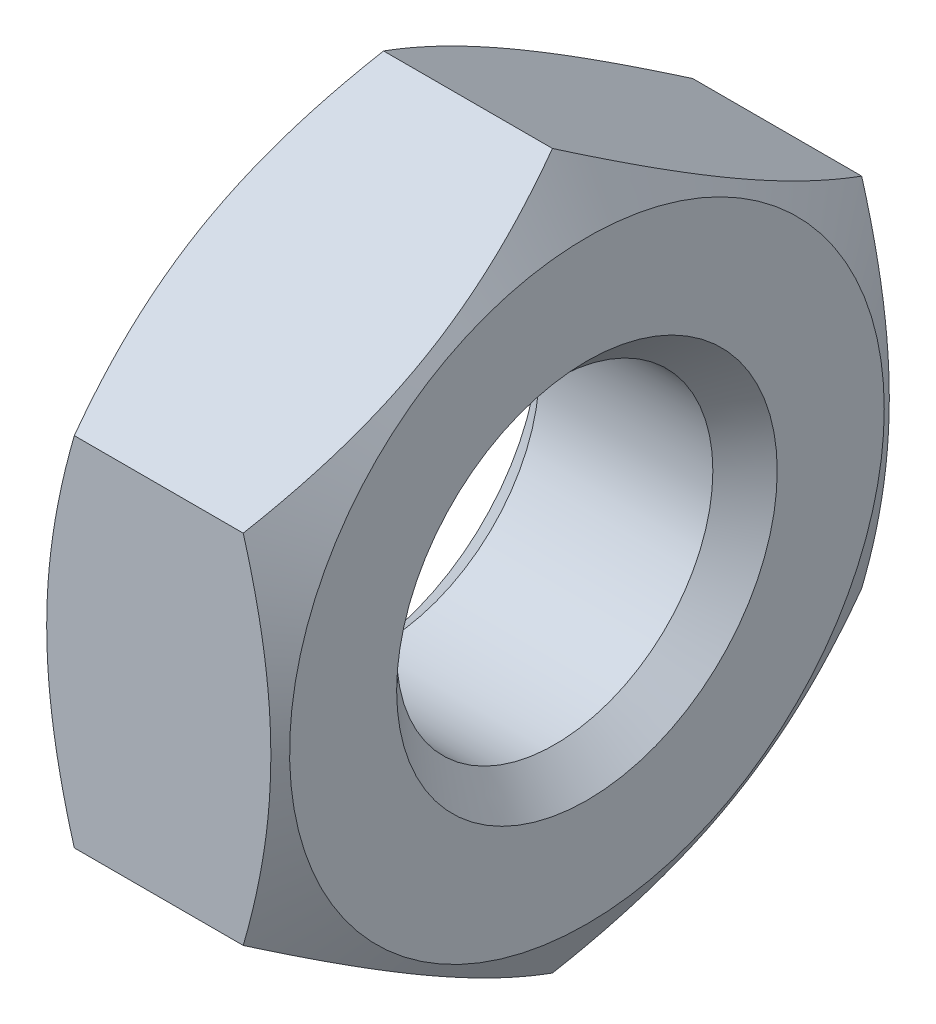
ISO-10303-21;
HEADER;
FILE_DESCRIPTION(('STEP AP214'),'2;1');
FILE_NAME('part.step','',(''),(''),'','','');
FILE_SCHEMA(('AUTOMOTIVE_DESIGN { 1 0 10303 214 1 1 1 1 }'));
ENDSEC;
DATA;
#1=APPLICATION_CONTEXT('core data for automotive mechanical design processes');
#2=APPLICATION_PROTOCOL_DEFINITION('international standard','automotive_design',2000,#1);
#3=PRODUCT_CONTEXT('',#1,'mechanical');
#4=PRODUCT('Part','Part','',(#3));
#5=PRODUCT_RELATED_PRODUCT_CATEGORY('part','',(#4));
#6=PRODUCT_DEFINITION_FORMATION('','',#4);
#7=PRODUCT_DEFINITION_CONTEXT('part definition',#1,'design');
#8=PRODUCT_DEFINITION('design','',#6,#7);
#9=PRODUCT_DEFINITION_SHAPE('','',#8);
#10=(LENGTH_UNIT() NAMED_UNIT(*) SI_UNIT(.MILLI.,.METRE.));
#11=(NAMED_UNIT(*) PLANE_ANGLE_UNIT() SI_UNIT($,.RADIAN.));
#12=(NAMED_UNIT(*) SI_UNIT($,.STERADIAN.) SOLID_ANGLE_UNIT());
#13=UNCERTAINTY_MEASURE_WITH_UNIT(LENGTH_MEASURE(1.E-05),#10,'distance_accuracy_value','');
#14=(GEOMETRIC_REPRESENTATION_CONTEXT(3) GLOBAL_UNCERTAINTY_ASSIGNED_CONTEXT((#13)) GLOBAL_UNIT_ASSIGNED_CONTEXT((#10,
#11,#12)) REPRESENTATION_CONTEXT('',''));
#15=CARTESIAN_POINT('',(0.,0.,0.));
#16=DIRECTION('',(0.,0.,1.));
#17=DIRECTION('',(1.,0.,0.));
#18=AXIS2_PLACEMENT_3D('',#15,#16,#17);
#19=CARTESIAN_POINT('',(2.5,0.,0.));
#20=DIRECTION('',(1.,0.,0.));
#21=DIRECTION('',(0.,0.,-1.));
#22=AXIS2_PLACEMENT_3D('',#19,#20,#21);
#23=PLANE('',#22);
#24=CARTESIAN_POINT('',(2.5,0.,0.));
#25=DIRECTION('',(1.,0.,0.));
#26=DIRECTION('',(0.,0.,-1.));
#27=AXIS2_PLACEMENT_3D('',#24,#25,#26);
#28=CIRCLE('',#27,3.99999999999999);
#29=CARTESIAN_POINT('',(2.5,0.,-3.99999999999999));
#30=VERTEX_POINT('',#29);
#31=EDGE_CURVE('E12',#30,#30,#28,.F.);
#32=ORIENTED_EDGE('',*,*,#31,.T.);
#33=EDGE_LOOP('',(#32));
#34=FACE_BOUND('',#33,.T.);
#35=CARTESIAN_POINT('',(2.5,0.,0.));
#36=DIRECTION('',(1.,0.,0.));
#37=DIRECTION('',(0.,0.,-1.));
#38=AXIS2_PLACEMENT_3D('',#35,#36,#37);
#39=CIRCLE('',#38,6.25);
#40=CARTESIAN_POINT('',(2.5,0.,-6.25));
#41=VERTEX_POINT('',#40);
#42=EDGE_CURVE('E311',#41,#41,#39,.T.);
#43=ORIENTED_EDGE('',*,*,#42,.T.);
#44=EDGE_LOOP('',(#43));
#45=FACE_BOUND('',#44,.T.);
#46=ADVANCED_FACE('F52',(#34,#45),#23,.T.);
#47=CARTESIAN_POINT('',(2.5,-3.7527767497326,-6.5));
#48=DIRECTION('',(0.,0.,1.));
#49=DIRECTION('',(1.,0.,0.));
#50=AXIS2_PLACEMENT_3D('',#47,#48,#49);
#51=PLANE('',#50);
#52=DIRECTION('',(-1.,0.,0.));
#53=VECTOR('',#52,1.);
#54=CARTESIAN_POINT('',(2.5,-3.7527767497326,-6.5));
#55=LINE('',#54,#53);
#56=CARTESIAN_POINT('',(1.7751058491021,-3.75277674973308,-6.5));
#57=VERTEX_POINT('',#56);
#58=CARTESIAN_POINT('',(-1.7751058491021,-3.75277674973308,-6.5));
#59=VERTEX_POINT('',#58);
#60=EDGE_CURVE('E498',#57,#59,#55,.T.);
#61=ORIENTED_EDGE('',*,*,#60,.T.);
#62=CARTESIAN_POINT('',(-1.7751058491021,-3.75277674973308,-6.5));
#63=CARTESIAN_POINT('',(-1.84832684610049,-3.499131775769,-6.5));
#64=CARTESIAN_POINT('',(-1.91779853135632,-3.23864657335637,-6.5));
#65=CARTESIAN_POINT('',(-2.13073900859658,-2.3541337637969,-6.5));
#66=CARTESIAN_POINT('',(-2.24546268397608,-1.70890627516408,-6.5));
#67=CARTESIAN_POINT('',(-2.3384851778033,-0.713276650029492,-6.5));
#68=CARTESIAN_POINT('',(-2.35508917844649,-0.356511537320582,-6.5));
#69=CARTESIAN_POINT('',(-2.35516043665236,1.00336414524116E-07,-6.5));
#70=B_SPLINE_CURVE_WITH_KNOTS('',3,(#62,#63,#64,#65,#66,#67,#68,#69),.UNSPECIFIED.,.F.,.F.,(4,2,
2,4),(0.,0.10439310637018,0.359751575430984,0.499804918726466),.UNSPECIFIED.);
#71=CARTESIAN_POINT('',(-2.35566243270259,0.,-6.5));
#72=VERTEX_POINT('',#71);
#73=EDGE_CURVE('E501',#59,#72,#70,.T.);
#74=ORIENTED_EDGE('',*,*,#73,.T.);
#75=CARTESIAN_POINT('',(-2.35516043665236,1.00336414524116E-07,-6.5));
#76=CARTESIAN_POINT('',(-2.3552191031304,0.293514116135507,-6.5));
#77=CARTESIAN_POINT('',(-2.34407165224937,0.586856323102029,-6.5));
#78=CARTESIAN_POINT('',(-2.24664519389048,1.84805337930432,-6.5));
#79=CARTESIAN_POINT('',(-2.04506645528435,2.81760577783207,-6.5));
#80=CARTESIAN_POINT('',(-1.77510584910179,3.7527767497326,-6.5));
#81=B_SPLINE_CURVE_WITH_KNOTS('',3,(#75,#76,#77,#78,#79,#80),.UNSPECIFIED.,.F.,.F.,(4,2,4),
(0.499804918726466,0.615110044491788,1.),.UNSPECIFIED.);
#82=CARTESIAN_POINT('',(-1.77510584910179,3.7527767497326,-6.5));
#83=VERTEX_POINT('',#82);
#84=EDGE_CURVE('E504',#72,#83,#81,.T.);
#85=ORIENTED_EDGE('',*,*,#84,.T.);
#86=DIRECTION('',(-1.,0.,0.));
#87=VECTOR('',#86,1.);
#88=CARTESIAN_POINT('',(2.5,3.7527767497326,-6.5));
#89=LINE('',#88,#87);
#90=CARTESIAN_POINT('',(1.77510584910179,3.7527767497326,-6.5));
#91=VERTEX_POINT('',#90);
#92=EDGE_CURVE('E153',#91,#83,#89,.T.);
#93=ORIENTED_EDGE('',*,*,#92,.F.);
#94=CARTESIAN_POINT('',(1.77510584910179,3.7527767497326,-6.5));
#95=CARTESIAN_POINT('',(2.04506645528435,2.81760577783207,-6.5));
#96=CARTESIAN_POINT('',(2.24664519389048,1.84805337930432,-6.5));
#97=CARTESIAN_POINT('',(2.34407165224937,0.586856323102031,-6.5));
#98=CARTESIAN_POINT('',(2.3552191031304,0.293514116135509,-6.5));
#99=CARTESIAN_POINT('',(2.35516043665236,1.0033641669252E-07,-6.5));
#100=B_SPLINE_CURVE_WITH_KNOTS('',3,(#94,#95,#96,#97,#98,#99),.UNSPECIFIED.,.F.,.F.,(4,2,4),(0.,
0.384889955508212,0.500195081273534),.UNSPECIFIED.);
#101=CARTESIAN_POINT('',(2.35566243270259,0.,-6.5));
#102=VERTEX_POINT('',#101);
#103=EDGE_CURVE('E508',#91,#102,#100,.T.);
#104=ORIENTED_EDGE('',*,*,#103,.T.);
#105=CARTESIAN_POINT('',(2.35516043665236,1.0033641669252E-07,-6.5));
#106=CARTESIAN_POINT('',(2.35508917844649,-0.356511537320579,-6.5));
#107=CARTESIAN_POINT('',(2.3384851778033,-0.713276650029488,-6.5));
#108=CARTESIAN_POINT('',(2.24546268397608,-1.70890627516408,-6.5));
#109=CARTESIAN_POINT('',(2.13073900859659,-2.35413376379689,-6.5));
#110=CARTESIAN_POINT('',(1.91779853135632,-3.23864657335637,-6.5));
#111=CARTESIAN_POINT('',(1.84832684610049,-3.49913177576899,-6.5));
#112=CARTESIAN_POINT('',(1.7751058491021,-3.75277674973308,-6.5));
#113=B_SPLINE_CURVE_WITH_KNOTS('',3,(#105,#106,#107,#108,#109,#110,#111,#112),.UNSPECIFIED.,.F.,
.F.,(4,2,2,4),(0.500195081273534,0.640248424569016,0.895606893629819,1.),.UNSPECIFIED.);
#114=EDGE_CURVE('E495',#102,#57,#113,.T.);
#115=ORIENTED_EDGE('',*,*,#114,.T.);
#116=EDGE_LOOP('',(#61,#74,#85,#93,#104,#115));
#117=FACE_BOUND('',#116,.T.);
#118=ADVANCED_FACE('F193',(#117),#51,.F.);
#119=CARTESIAN_POINT('',(0.,0.,0.));
#120=DIRECTION('',(-1.,0.,0.));
#121=DIRECTION('',(0.,-1.,0.));
#122=AXIS2_PLACEMENT_3D('',#119,#120,#121);
#123=CONICAL_SURFACE('',#122,10.580127018922,1.04719755119658);
#124=CARTESIAN_POINT('',(2.35516043665236,1.00336414957797E-07,6.5));
#125=CARTESIAN_POINT('',(2.3552191031304,0.293514116135507,6.5));
#126=CARTESIAN_POINT('',(2.34407165224937,0.586856323102029,6.5));
#127=CARTESIAN_POINT('',(2.24664519389048,1.84805337930432,6.5));
#128=CARTESIAN_POINT('',(2.04506645528435,2.81760577783207,6.5));
#129=CARTESIAN_POINT('',(1.77510584910179,3.7527767497326,6.5));
#130=B_SPLINE_CURVE_WITH_KNOTS('',3,(#124,#125,#126,#127,#128,#129),.UNSPECIFIED.,.F.,.F.,(4,2,
4),(0.499804918726445,0.615110044491772,1.),.UNSPECIFIED.);
#131=CARTESIAN_POINT('',(2.35566243270259,0.,6.5));
#132=VERTEX_POINT('',#131);
#133=CARTESIAN_POINT('',(1.77510584910179,3.7527767497326,6.5));
#134=VERTEX_POINT('',#133);
#135=EDGE_CURVE('E69',#132,#134,#130,.T.);
#136=ORIENTED_EDGE('',*,*,#135,.F.);
#137=CARTESIAN_POINT('',(1.77510584910179,-3.7527767497326,6.5));
#138=CARTESIAN_POINT('',(1.84832684610014,-3.49913177576862,6.5));
#139=CARTESIAN_POINT('',(1.91779853135635,-3.23864657335627,6.5));
#140=CARTESIAN_POINT('',(2.13073900859659,-2.35413376379689,6.5));
#141=CARTESIAN_POINT('',(2.24546268397608,-1.70890627516408,6.5));
#142=CARTESIAN_POINT('',(2.3384851778033,-0.713276650029488,6.5));
#143=CARTESIAN_POINT('',(2.35508917844649,-0.35651153732058,6.5));
#144=CARTESIAN_POINT('',(2.35516043665236,1.00336414957797E-07,6.5));
#145=B_SPLINE_CURVE_WITH_KNOTS('',3,(#137,#138,#139,#140,#141,#142,#143,#144),.UNSPECIFIED.,.F.,
.F.,(4,2,2,4),(0.,0.104393106370142,0.359751575430957,0.499804918726445),.UNSPECIFIED.);
#146=CARTESIAN_POINT('',(1.77510584910179,-3.7527767497326,6.5));
#147=VERTEX_POINT('',#146);
#148=EDGE_CURVE('E74',#147,#132,#145,.T.);
#149=ORIENTED_EDGE('',*,*,#148,.F.);
#150=CARTESIAN_POINT('',(1.77503918089672,-7.50566896951893,-0.000200000000001414));
#151=CARTESIAN_POINT('',(1.96277117666729,-7.18052262104625,0.562969995450193));
#152=CARTESIAN_POINT('',(2.11841916481587,-6.84652652333584,1.14146820621437));
#153=CARTESIAN_POINT('',(2.32097290190676,-6.17729794516983,2.30060610547501));
#154=CARTESIAN_POINT('',(2.36852506887334,-5.83408564151025,2.89506725319617));
#155=CARTESIAN_POINT('',(2.33855983788199,-5.20136437402766,3.99097263550541));
#156=CARTESIAN_POINT('',(2.27696933775202,-4.90503247904517,4.50423453351826));
#157=CARTESIAN_POINT('',(2.07729007331418,-4.32460789500159,5.50955940304378));
#158=CARTESIAN_POINT('',(1.93839113803318,-4.03558211137176,6.01016674498807));
#159=CARTESIAN_POINT('',(1.77503918089669,-3.75266127967876,6.5002));
#160=B_SPLINE_CURVE_WITH_KNOTS('',3,(#150,#151,#152,#153,#154,#155,#156,#157,#158,#159),
.UNSPECIFIED.,.F.,.F.,(4,2,2,2,4),(0.,0.267360547550097,0.534721095100195,0.767360547550097,1.),.UNSPECIFIED.);
#161=CARTESIAN_POINT('',(1.77510584910182,-7.5055534994651,0.));
#162=VERTEX_POINT('',#161);
#163=EDGE_CURVE('E347',#162,#147,#160,.T.);
#164=ORIENTED_EDGE('',*,*,#163,.F.);
#165=CARTESIAN_POINT('',(1.77503918089669,-3.75266127967876,-6.5002));
#166=CARTESIAN_POINT('',(1.96277117666726,-4.07780762815145,-5.93703000454981));
#167=CARTESIAN_POINT('',(2.11841916481584,-4.41180372586186,-5.35853179378562));
#168=CARTESIAN_POINT('',(2.32097290190675,-5.08103230402788,-4.19939389452497));
#169=CARTESIAN_POINT('',(2.36852506887333,-5.42424460768746,-3.60493274680382));
#170=CARTESIAN_POINT('',(2.338559837882,-6.05696587517005,-2.50902736449458));
#171=CARTESIAN_POINT('',(2.27696933775203,-6.35329777015254,-1.99576546648173));
#172=CARTESIAN_POINT('',(2.0772900733142,-6.93372235419611,-0.990440596956211));
#173=CARTESIAN_POINT('',(1.93839113803321,-7.22274813782594,-0.489833255011931));
#174=CARTESIAN_POINT('',(1.77503918089672,-7.50566896951894,0.000200000000000604));
#175=B_SPLINE_CURVE_WITH_KNOTS('',3,(#165,#166,#167,#168,#169,#170,#171,#172,#173,#174),
.UNSPECIFIED.,.F.,.F.,(4,2,2,2,4),(0.,0.267360547550099,0.534721095100198,0.767360547550099,1.),.UNSPECIFIED.);
#176=EDGE_CURVE('E492',#57,#162,#175,.T.);
#177=ORIENTED_EDGE('',*,*,#176,.F.);
#178=ORIENTED_EDGE('',*,*,#114,.F.);
#179=ORIENTED_EDGE('',*,*,#103,.F.);
#180=CARTESIAN_POINT('',(1.77503918089672,7.50566896951893,0.000200000000001414));
#181=CARTESIAN_POINT('',(1.96277117666729,7.18052262104625,-0.562969995450193));
#182=CARTESIAN_POINT('',(2.11841916481587,6.84652652333584,-1.14146820621437));
#183=CARTESIAN_POINT('',(2.32097290190676,6.17729794516983,-2.30060610547501));
#184=CARTESIAN_POINT('',(2.36852506887334,5.83408564151025,-2.89506725319617));
#185=CARTESIAN_POINT('',(2.33855983788199,5.20136437402766,-3.99097263550541));
#186=CARTESIAN_POINT('',(2.27696933775202,4.90503247904517,-4.50423453351826));
#187=CARTESIAN_POINT('',(2.07729007331418,4.32460789500159,-5.50955940304378));
#188=CARTESIAN_POINT('',(1.93839113803318,4.03558211137176,-6.01016674498806));
#189=CARTESIAN_POINT('',(1.77503918089669,3.75266127967876,-6.5002));
#190=B_SPLINE_CURVE_WITH_KNOTS('',3,(#180,#181,#182,#183,#184,#185,#186,#187,#188,#189),
.UNSPECIFIED.,.F.,.F.,(4,2,2,2,4),(0.,0.267360547550097,0.534721095100195,0.767360547550097,1.),.UNSPECIFIED.);
#191=CARTESIAN_POINT('',(1.77510584910182,7.5055534994651,0.));
#192=VERTEX_POINT('',#191);
#193=EDGE_CURVE('E511',#192,#91,#190,.T.);
#194=ORIENTED_EDGE('',*,*,#193,.F.);
#195=CARTESIAN_POINT('',(1.77503918089669,3.75266127967876,6.5002));
#196=CARTESIAN_POINT('',(1.96277117666726,4.07780762815145,5.93703000454981));
#197=CARTESIAN_POINT('',(2.11841916481584,4.41180372586186,5.35853179378562));
#198=CARTESIAN_POINT('',(2.32097290190675,5.08103230402788,4.19939389452497));
#199=CARTESIAN_POINT('',(2.36852506887333,5.42424460768746,3.60493274680382));
#200=CARTESIAN_POINT('',(2.338559837882,6.05696587517005,2.50902736449458));
#201=CARTESIAN_POINT('',(2.27696933775203,6.35329777015254,1.99576546648173));
#202=CARTESIAN_POINT('',(2.0772900733142,6.93372235419611,0.990440596956211));
#203=CARTESIAN_POINT('',(1.93839113803321,7.22274813782594,0.489833255011931));
#204=CARTESIAN_POINT('',(1.77503918089672,7.50566896951894,-0.000200000000000412));
#205=B_SPLINE_CURVE_WITH_KNOTS('',3,(#195,#196,#197,#198,#199,#200,#201,#202,#203,#204),
.UNSPECIFIED.,.F.,.F.,(4,2,2,2,4),(0.,0.267360547550099,0.534721095100198,0.767360547550099,1.),.UNSPECIFIED.);
#206=EDGE_CURVE('E144',#134,#192,#205,.T.);
#207=ORIENTED_EDGE('',*,*,#206,.F.);
#208=EDGE_LOOP('',(#136,#149,#164,#177,#178,#179,#194,#207));
#209=FACE_BOUND('',#208,.T.);
#210=ORIENTED_EDGE('',*,*,#42,.F.);
#211=EDGE_LOOP('',(#210));
#212=FACE_BOUND('',#211,.T.);
#213=ADVANCED_FACE('F203',(#209,#212),#123,.T.);
#214=CARTESIAN_POINT('',(2.5,3.7527767497326,6.5));
#215=DIRECTION('',(0.,0.,-1.));
#216=DIRECTION('',(-1.,0.,0.));
#217=AXIS2_PLACEMENT_3D('',#214,#215,#216);
#218=PLANE('',#217);
#219=DIRECTION('',(-1.,0.,0.));
#220=VECTOR('',#219,1.);
#221=CARTESIAN_POINT('',(2.5,3.7527767497326,6.5));
#222=LINE('',#221,#220);
#223=CARTESIAN_POINT('',(-1.77510584910179,3.7527767497326,6.5));
#224=VERTEX_POINT('',#223);
#225=EDGE_CURVE('E519',#134,#224,#222,.T.);
#226=ORIENTED_EDGE('',*,*,#225,.T.);
#227=CARTESIAN_POINT('',(-1.77510584910179,3.7527767497326,6.5));
#228=CARTESIAN_POINT('',(-2.04506645528435,2.81760577783207,6.5));
#229=CARTESIAN_POINT('',(-2.24664519389048,1.84805337930432,6.5));
#230=CARTESIAN_POINT('',(-2.34407165224937,0.58685632310203,6.5));
#231=CARTESIAN_POINT('',(-2.3552191031304,0.293514116135508,6.5));
#232=CARTESIAN_POINT('',(-2.35516043665236,1.00336415825159E-07,6.5));
#233=B_SPLINE_CURVE_WITH_KNOTS('',3,(#227,#228,#229,#230,#231,#232),.UNSPECIFIED.,.F.,.F.,(4,2,
4),(0.,0.384889955508229,0.500195081273555),.UNSPECIFIED.);
#234=CARTESIAN_POINT('',(-2.35566243270259,0.,6.5));
#235=VERTEX_POINT('',#234);
#236=EDGE_CURVE('E131',#224,#235,#233,.T.);
#237=ORIENTED_EDGE('',*,*,#236,.T.);
#238=CARTESIAN_POINT('',(-2.35516043665236,1.00336415825159E-07,6.5));
#239=CARTESIAN_POINT('',(-2.35508917844649,-0.356511537320581,6.5));
#240=CARTESIAN_POINT('',(-2.3384851778033,-0.71327665002949,6.5));
#241=CARTESIAN_POINT('',(-2.24546268397608,-1.70890627516408,6.5));
#242=CARTESIAN_POINT('',(-2.13073900859658,-2.3541337637969,6.5));
#243=CARTESIAN_POINT('',(-1.91779853135634,-3.23864657335627,6.5));
#244=CARTESIAN_POINT('',(-1.84832684610014,-3.49913177576862,6.5));
#245=CARTESIAN_POINT('',(-1.77510584910178,-3.7527767497326,6.5));
#246=B_SPLINE_CURVE_WITH_KNOTS('',3,(#238,#239,#240,#241,#242,#243,#244,#245),.UNSPECIFIED.,.F.,
.F.,(4,2,2,4),(0.500195081273555,0.640248424569044,0.895606893629859,1.),.UNSPECIFIED.);
#247=CARTESIAN_POINT('',(-1.77510584910179,-3.7527767497326,6.5));
#248=VERTEX_POINT('',#247);
#249=EDGE_CURVE('E297',#235,#248,#246,.T.);
#250=ORIENTED_EDGE('',*,*,#249,.T.);
#251=DIRECTION('',(-1.,0.,0.));
#252=VECTOR('',#251,1.);
#253=CARTESIAN_POINT('',(2.5,-3.7527767497326,6.5));
#254=LINE('',#253,#252);
#255=EDGE_CURVE('E401',#147,#248,#254,.T.);
#256=ORIENTED_EDGE('',*,*,#255,.F.);
#257=ORIENTED_EDGE('',*,*,#148,.T.);
#258=ORIENTED_EDGE('',*,*,#135,.T.);
#259=EDGE_LOOP('',(#226,#237,#250,#256,#257,#258));
#260=FACE_BOUND('',#259,.T.);
#261=ADVANCED_FACE('F371',(#260),#218,.F.);
#262=CARTESIAN_POINT('',(2.5,-3.7527767497326,6.5));
#263=DIRECTION('',(0.,0.866025403784443,-0.499999999999993));
#264=DIRECTION('',(0.,0.499999999999993,0.866025403784443));
#265=AXIS2_PLACEMENT_3D('',#262,#263,#264);
#266=PLANE('',#265);
#267=ORIENTED_EDGE('',*,*,#255,.T.);
#268=CARTESIAN_POINT('',(-1.77503918089668,-3.75266127967876,6.5002));
#269=CARTESIAN_POINT('',(-1.96277117666726,-4.07780762815145,5.9370300045498));
#270=CARTESIAN_POINT('',(-2.11841916481584,-4.41180372586186,5.35853179378562));
#271=CARTESIAN_POINT('',(-2.32097290190675,-5.08103230402788,4.19939389452497));
#272=CARTESIAN_POINT('',(-2.36852506887333,-5.42424460768746,3.60493274680381));
#273=CARTESIAN_POINT('',(-2.33855983788199,-6.05696587517004,2.50902736449457));
#274=CARTESIAN_POINT('',(-2.27696933775203,-6.35329777015253,1.99576546648173));
#275=CARTESIAN_POINT('',(-2.0772900733142,-6.93372235419611,0.990440596956209));
#276=CARTESIAN_POINT('',(-1.9383911380332,-7.22274813782593,0.48983325501193));
#277=CARTESIAN_POINT('',(-1.77503918089671,-7.50566896951894,-0.000200000000002282));
#278=B_SPLINE_CURVE_WITH_KNOTS('',3,(#268,#269,#270,#271,#272,#273,#274,#275,#276,#277),
.UNSPECIFIED.,.F.,.F.,(4,2,2,2,4),(0.,0.267360547550099,0.534721095100198,0.767360547550099,1.),.UNSPECIFIED.);
#279=CARTESIAN_POINT('',(-1.77510584910182,-7.5055534994651,0.));
#280=VERTEX_POINT('',#279);
#281=EDGE_CURVE('E405',#248,#280,#278,.T.);
#282=ORIENTED_EDGE('',*,*,#281,.T.);
#283=DIRECTION('',(-1.,0.,0.));
#284=VECTOR('',#283,1.);
#285=CARTESIAN_POINT('',(2.5,-7.5055534994651,0.));
#286=LINE('',#285,#284);
#287=EDGE_CURVE('E418',#162,#280,#286,.T.);
#288=ORIENTED_EDGE('',*,*,#287,.F.);
#289=ORIENTED_EDGE('',*,*,#163,.T.);
#290=EDGE_LOOP('',(#267,#282,#288,#289));
#291=FACE_BOUND('',#290,.T.);
#292=ADVANCED_FACE('F379',(#291),#266,.F.);
#293=CARTESIAN_POINT('',(2.5,-7.5055534994651,0.));
#294=DIRECTION('',(0.,0.866025403784443,0.499999999999993));
#295=DIRECTION('',(0.,-0.499999999999993,0.866025403784443));
#296=AXIS2_PLACEMENT_3D('',#293,#294,#295);
#297=PLANE('',#296);
#298=ORIENTED_EDGE('',*,*,#287,.T.);
#299=CARTESIAN_POINT('',(-1.77503918089671,-7.50566896951894,0.000200000000000797));
#300=CARTESIAN_POINT('',(-1.96277117666728,-7.18052262104625,-0.562969995450194));
#301=CARTESIAN_POINT('',(-2.11841916481586,-6.84652652333585,-1.14146820621437));
#302=CARTESIAN_POINT('',(-2.32097290190676,-6.17729794516983,-2.30060610547501));
#303=CARTESIAN_POINT('',(-2.36852506887334,-5.83408564151025,-2.89506725319617));
#304=CARTESIAN_POINT('',(-2.33855983788199,-5.20136437402767,-3.99097263550541));
#305=CARTESIAN_POINT('',(-2.27696933775202,-4.90503247904518,-4.50423453351826));
#306=CARTESIAN_POINT('',(-2.07729007331418,-4.3246078950016,-5.50955940304378));
#307=CARTESIAN_POINT('',(-1.93839113803318,-4.03558211137177,-6.01016674498807));
#308=CARTESIAN_POINT('',(-1.77503918089668,-3.75266127967877,-6.5002));
#309=B_SPLINE_CURVE_WITH_KNOTS('',3,(#299,#300,#301,#302,#303,#304,#305,#306,#307,#308),
.UNSPECIFIED.,.F.,.F.,(4,2,2,2,4),(0.,0.267360547550097,0.534721095100194,0.767360547550097,1.),.UNSPECIFIED.);
#310=EDGE_CURVE('E137',#280,#59,#309,.T.);
#311=ORIENTED_EDGE('',*,*,#310,.T.);
#312=ORIENTED_EDGE('',*,*,#60,.F.);
#313=ORIENTED_EDGE('',*,*,#176,.T.);
#314=EDGE_LOOP('',(#298,#311,#312,#313));
#315=FACE_BOUND('',#314,.T.);
#316=ADVANCED_FACE('F260',(#315),#297,.F.);
#317=CARTESIAN_POINT('',(-2.5,0.,0.));
#318=DIRECTION('',(1.,0.,0.));
#319=DIRECTION('',(0.,-1.,0.));
#320=AXIS2_PLACEMENT_3D('',#317,#318,#319);
#321=CONICAL_SURFACE('',#320,6.25,1.04719755119658);
#322=ORIENTED_EDGE('',*,*,#84,.F.);
#323=ORIENTED_EDGE('',*,*,#73,.F.);
#324=ORIENTED_EDGE('',*,*,#310,.F.);
#325=ORIENTED_EDGE('',*,*,#281,.F.);
#326=ORIENTED_EDGE('',*,*,#249,.F.);
#327=ORIENTED_EDGE('',*,*,#236,.F.);
#328=CARTESIAN_POINT('',(-1.77503918089671,7.50566896951894,-0.000200000000000797));
#329=CARTESIAN_POINT('',(-1.96277117666728,7.18052262104625,0.562969995450194));
#330=CARTESIAN_POINT('',(-2.11841916481586,6.84652652333585,1.14146820621437));
#331=CARTESIAN_POINT('',(-2.32097290190676,6.17729794516983,2.30060610547501));
#332=CARTESIAN_POINT('',(-2.36852506887334,5.83408564151025,2.89506725319617));
#333=CARTESIAN_POINT('',(-2.33855983788199,5.20136437402767,3.99097263550541));
#334=CARTESIAN_POINT('',(-2.27696933775201,4.90503247904518,4.50423453351826));
#335=CARTESIAN_POINT('',(-2.07729007331418,4.3246078950016,5.50955940304378));
#336=CARTESIAN_POINT('',(-1.93839113803318,4.03558211137177,6.01016674498807));
#337=CARTESIAN_POINT('',(-1.77503918089669,3.75266127967877,6.5002));
#338=B_SPLINE_CURVE_WITH_KNOTS('',3,(#328,#329,#330,#331,#332,#333,#334,#335,#336,#337),
.UNSPECIFIED.,.F.,.F.,(4,2,2,2,4),(0.,0.267360547550097,0.534721095100194,0.767360547550097,1.),.UNSPECIFIED.);
#339=CARTESIAN_POINT('',(-1.77510584910182,7.5055534994651,0.));
#340=VERTEX_POINT('',#339);
#341=EDGE_CURVE('E120',#340,#224,#338,.T.);
#342=ORIENTED_EDGE('',*,*,#341,.F.);
#343=CARTESIAN_POINT('',(-1.77503918089668,3.75266127967876,-6.5002));
#344=CARTESIAN_POINT('',(-1.96277117666726,4.07780762815145,-5.9370300045498));
#345=CARTESIAN_POINT('',(-2.11841916481584,4.41180372586186,-5.35853179378562));
#346=CARTESIAN_POINT('',(-2.32097290190675,5.08103230402788,-4.19939389452497));
#347=CARTESIAN_POINT('',(-2.36852506887333,5.42424460768746,-3.60493274680381));
#348=CARTESIAN_POINT('',(-2.33855983788199,6.05696587517004,-2.50902736449457));
#349=CARTESIAN_POINT('',(-2.27696933775203,6.35329777015253,-1.99576546648173));
#350=CARTESIAN_POINT('',(-2.0772900733142,6.93372235419611,-0.990440596956209));
#351=CARTESIAN_POINT('',(-1.9383911380332,7.22274813782593,-0.48983325501193));
#352=CARTESIAN_POINT('',(-1.77503918089671,7.50566896951894,0.000200000000002282));
#353=B_SPLINE_CURVE_WITH_KNOTS('',3,(#343,#344,#345,#346,#347,#348,#349,#350,#351,#352),
.UNSPECIFIED.,.F.,.F.,(4,2,2,2,4),(0.,0.267360547550099,0.534721095100198,0.767360547550099,1.),.UNSPECIFIED.);
#354=EDGE_CURVE('E127',#83,#340,#353,.T.);
#355=ORIENTED_EDGE('',*,*,#354,.F.);
#356=EDGE_LOOP('',(#322,#323,#324,#325,#326,#327,#342,#355));
#357=FACE_BOUND('',#356,.T.);
#358=CARTESIAN_POINT('',(-2.5,0.,0.));
#359=DIRECTION('',(1.,0.,0.));
#360=DIRECTION('',(0.,0.,-1.));
#361=AXIS2_PLACEMENT_3D('',#358,#359,#360);
#362=CIRCLE('',#361,6.25);
#363=CARTESIAN_POINT('',(-2.5,0.,-6.25));
#364=VERTEX_POINT('',#363);
#365=EDGE_CURVE('E149',#364,#364,#362,.T.);
#366=ORIENTED_EDGE('',*,*,#365,.T.);
#367=EDGE_LOOP('',(#366));
#368=FACE_BOUND('',#367,.T.);
#369=ADVANCED_FACE('F124',(#357,#368),#321,.T.);
#370=CARTESIAN_POINT('',(-2.5,0.,0.));
#371=DIRECTION('',(1.,0.,0.));
#372=DIRECTION('',(0.,0.,-1.));
#373=AXIS2_PLACEMENT_3D('',#370,#371,#372);
#374=PLANE('',#373);
#375=CARTESIAN_POINT('',(-2.5,0.,0.));
#376=DIRECTION('',(1.,0.,0.));
#377=DIRECTION('',(0.,0.,-1.));
#378=AXIS2_PLACEMENT_3D('',#375,#376,#377);
#379=CIRCLE('',#378,3.99999999999998);
#380=CARTESIAN_POINT('',(-2.5,0.,-3.99999999999998));
#381=VERTEX_POINT('',#380);
#382=EDGE_CURVE('E301',#381,#381,#379,.T.);
#383=ORIENTED_EDGE('',*,*,#382,.T.);
#384=EDGE_LOOP('',(#383));
#385=FACE_BOUND('',#384,.T.);
#386=ORIENTED_EDGE('',*,*,#365,.F.);
#387=EDGE_LOOP('',(#386));
#388=FACE_BOUND('',#387,.T.);
#389=ADVANCED_FACE('F251',(#385,#388),#374,.F.);
#390=CARTESIAN_POINT('',(2.5,3.7527767497326,-6.5));
#391=DIRECTION('',(0.,-0.866025403784443,0.499999999999993));
#392=DIRECTION('',(0.,-0.499999999999993,-0.866025403784443));
#393=AXIS2_PLACEMENT_3D('',#390,#391,#392);
#394=PLANE('',#393);
#395=ORIENTED_EDGE('',*,*,#92,.T.);
#396=ORIENTED_EDGE('',*,*,#354,.T.);
#397=DIRECTION('',(-1.,0.,0.));
#398=VECTOR('',#397,1.);
#399=CARTESIAN_POINT('',(2.5,7.5055534994651,0.));
#400=LINE('',#399,#398);
#401=EDGE_CURVE('E142',#192,#340,#400,.T.);
#402=ORIENTED_EDGE('',*,*,#401,.F.);
#403=ORIENTED_EDGE('',*,*,#193,.T.);
#404=EDGE_LOOP('',(#395,#396,#402,#403));
#405=FACE_BOUND('',#404,.T.);
#406=ADVANCED_FACE('F152',(#405),#394,.F.);
#407=CARTESIAN_POINT('',(2.5,7.5055534994651,0.));
#408=DIRECTION('',(0.,-0.866025403784443,-0.499999999999993));
#409=DIRECTION('',(0.,0.499999999999993,-0.866025403784443));
#410=AXIS2_PLACEMENT_3D('',#407,#408,#409);
#411=PLANE('',#410);
#412=ORIENTED_EDGE('',*,*,#401,.T.);
#413=ORIENTED_EDGE('',*,*,#341,.T.);
#414=ORIENTED_EDGE('',*,*,#225,.F.);
#415=ORIENTED_EDGE('',*,*,#206,.T.);
#416=EDGE_LOOP('',(#412,#413,#414,#415));
#417=FACE_BOUND('',#416,.T.);
#418=ADVANCED_FACE('F143',(#417),#411,.F.);
#419=CARTESIAN_POINT('',(2.5,0.,0.));
#420=DIRECTION('',(1.,0.,0.));
#421=DIRECTION('',(0.,0.,-1.));
#422=AXIS2_PLACEMENT_3D('',#419,#420,#421);
#423=CYLINDRICAL_SURFACE('',#422,3.32349999999999);
#424=CARTESIAN_POINT('',(-1.8235,0.,0.));
#425=DIRECTION('',(1.,0.,0.));
#426=DIRECTION('',(0.,0.,-1.));
#427=AXIS2_PLACEMENT_3D('',#424,#425,#426);
#428=CIRCLE('',#427,3.32349999999999);
#429=CARTESIAN_POINT('',(-1.8235,0.,-3.32349999999999));
#430=VERTEX_POINT('',#429);
#431=EDGE_CURVE('E62',#430,#430,#428,.F.);
#432=ORIENTED_EDGE('',*,*,#431,.T.);
#433=EDGE_LOOP('',(#432));
#434=FACE_BOUND('',#433,.T.);
#435=CARTESIAN_POINT('',(1.82350000000001,0.,0.));
#436=DIRECTION('',(1.,0.,0.));
#437=DIRECTION('',(0.,0.,-1.));
#438=AXIS2_PLACEMENT_3D('',#435,#436,#437);
#439=CIRCLE('',#438,3.32349999999999);
#440=CARTESIAN_POINT('',(1.82350000000001,0.,-3.32349999999999));
#441=VERTEX_POINT('',#440);
#442=EDGE_CURVE('E310',#441,#441,#439,.T.);
#443=ORIENTED_EDGE('',*,*,#442,.T.);
#444=EDGE_LOOP('',(#443));
#445=FACE_BOUND('',#444,.T.);
#446=ADVANCED_FACE('F318',(#434,#445),#423,.F.);
#447=CARTESIAN_POINT('',(-2.5,0.,0.));
#448=DIRECTION('',(-1.,0.,0.));
#449=DIRECTION('',(0.,0.,1.));
#450=AXIS2_PLACEMENT_3D('',#447,#448,#449);
#451=CONICAL_SURFACE('',#450,3.99999999999998,0.785398163397447);
#452=ORIENTED_EDGE('',*,*,#431,.F.);
#453=EDGE_LOOP('',(#452));
#454=FACE_BOUND('',#453,.T.);
#455=ORIENTED_EDGE('',*,*,#382,.F.);
#456=EDGE_LOOP('',(#455));
#457=FACE_BOUND('',#456,.T.);
#458=ADVANCED_FACE('F321',(#454,#457),#451,.F.);
#459=CARTESIAN_POINT('',(1.82350000000001,0.,0.));
#460=DIRECTION('',(1.,0.,0.));
#461=DIRECTION('',(0.,0.,-1.));
#462=AXIS2_PLACEMENT_3D('',#459,#460,#461);
#463=CONICAL_SURFACE('',#462,3.32349999999999,0.785398163397453);
#464=ORIENTED_EDGE('',*,*,#31,.F.);
#465=EDGE_LOOP('',(#464));
#466=FACE_BOUND('',#465,.T.);
#467=ORIENTED_EDGE('',*,*,#442,.F.);
#468=EDGE_LOOP('',(#467));
#469=FACE_BOUND('',#468,.T.);
#470=ADVANCED_FACE('F55',(#466,#469),#463,.F.);
#471=CLOSED_SHELL('',(#46,#118,#213,#261,#292,#316,#369,#389,#406,#418,#446,#458,#470));
#472=MANIFOLD_SOLID_BREP('B2',#471);
#473=ADVANCED_BREP_SHAPE_REPRESENTATION('',(#18,#472),#14);
#474=SHAPE_DEFINITION_REPRESENTATION(#9,#473);
ENDSEC;
END-ISO-10303-21;
